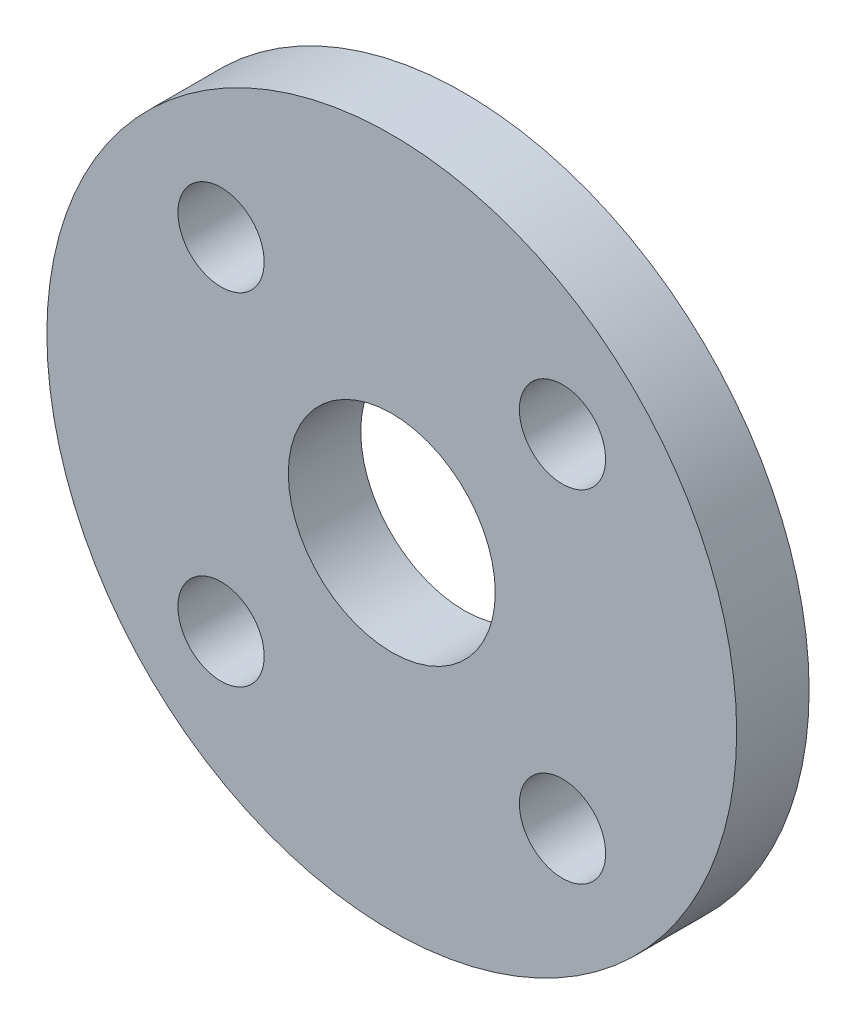
ISO-10303-21;
HEADER;
FILE_DESCRIPTION(('STEP AP214'),'2;1');
FILE_NAME('part.step','',(''),(''),'','','');
FILE_SCHEMA(('AUTOMOTIVE_DESIGN { 1 0 10303 214 1 1 1 1 }'));
ENDSEC;
DATA;
#1=APPLICATION_CONTEXT('core data for automotive mechanical design processes');
#2=APPLICATION_PROTOCOL_DEFINITION('international standard','automotive_design',2000,#1);
#3=PRODUCT_CONTEXT('',#1,'mechanical');
#4=PRODUCT('Part','Part','',(#3));
#5=PRODUCT_RELATED_PRODUCT_CATEGORY('part','',(#4));
#6=PRODUCT_DEFINITION_FORMATION('','',#4);
#7=PRODUCT_DEFINITION_CONTEXT('part definition',#1,'design');
#8=PRODUCT_DEFINITION('design','',#6,#7);
#9=PRODUCT_DEFINITION_SHAPE('','',#8);
#10=(LENGTH_UNIT() NAMED_UNIT(*) SI_UNIT(.MILLI.,.METRE.));
#11=(NAMED_UNIT(*) PLANE_ANGLE_UNIT() SI_UNIT($,.RADIAN.));
#12=(NAMED_UNIT(*) SI_UNIT($,.STERADIAN.) SOLID_ANGLE_UNIT());
#13=UNCERTAINTY_MEASURE_WITH_UNIT(LENGTH_MEASURE(1.E-05),#10,'distance_accuracy_value','');
#14=(GEOMETRIC_REPRESENTATION_CONTEXT(3) GLOBAL_UNCERTAINTY_ASSIGNED_CONTEXT((#13)) GLOBAL_UNIT_ASSIGNED_CONTEXT((#10,
#11,#12)) REPRESENTATION_CONTEXT('',''));
#15=CARTESIAN_POINT('',(0.,0.,0.));
#16=DIRECTION('',(0.,0.,1.));
#17=DIRECTION('',(1.,0.,0.));
#18=AXIS2_PLACEMENT_3D('',#15,#16,#17);
#19=CARTESIAN_POINT('',(12.5,0.,-16.9));
#20=DIRECTION('',(0.,0.,1.));
#21=DIRECTION('',(1.,0.,0.));
#22=AXIS2_PLACEMENT_3D('',#19,#20,#21);
#23=CYLINDRICAL_SURFACE('',#22,3.);
#24=CARTESIAN_POINT('',(12.5,0.,-15.6));
#25=DIRECTION('',(0.,0.,1.));
#26=DIRECTION('',(1.,0.,0.));
#27=AXIS2_PLACEMENT_3D('',#24,#25,#26);
#28=CIRCLE('',#27,3.);
#29=CARTESIAN_POINT('',(15.5,0.,-15.6));
#30=VERTEX_POINT('',#29);
#31=EDGE_CURVE('E19',#30,#30,#28,.F.);
#32=ORIENTED_EDGE('',*,*,#31,.F.);
#33=EDGE_LOOP('',(#32));
#34=FACE_BOUND('',#33,.T.);
#35=CARTESIAN_POINT('',(12.5,0.,-17.7));
#36=DIRECTION('',(0.,0.,1.));
#37=DIRECTION('',(1.,0.,0.));
#38=AXIS2_PLACEMENT_3D('',#35,#36,#37);
#39=CIRCLE('',#38,3.);
#40=CARTESIAN_POINT('',(15.5,0.,-17.7));
#41=VERTEX_POINT('',#40);
#42=EDGE_CURVE('E65',#41,#41,#39,.F.);
#43=ORIENTED_EDGE('',*,*,#42,.T.);
#44=EDGE_LOOP('',(#43));
#45=FACE_BOUND('',#44,.T.);
#46=ADVANCED_FACE('F15',(#34,#45),#23,.F.);
#47=CARTESIAN_POINT('',(12.5,0.,-15.6));
#48=DIRECTION('',(0.,0.,-1.));
#49=DIRECTION('',(-1.,0.,0.));
#50=AXIS2_PLACEMENT_3D('',#47,#48,#49);
#51=CYLINDRICAL_SURFACE('',#50,10.);
#52=CARTESIAN_POINT('',(12.5,0.,-15.6));
#53=DIRECTION('',(0.,0.,-1.));
#54=DIRECTION('',(-1.,0.,0.));
#55=AXIS2_PLACEMENT_3D('',#52,#53,#54);
#56=CIRCLE('',#55,10.);
#57=CARTESIAN_POINT('',(2.5,0.,-15.6));
#58=VERTEX_POINT('',#57);
#59=EDGE_CURVE('E58',#58,#58,#56,.T.);
#60=ORIENTED_EDGE('',*,*,#59,.T.);
#61=EDGE_LOOP('',(#60));
#62=FACE_BOUND('',#61,.T.);
#63=CARTESIAN_POINT('',(12.5,0.,-17.7));
#64=DIRECTION('',(0.,0.,-1.));
#65=DIRECTION('',(-1.,0.,0.));
#66=AXIS2_PLACEMENT_3D('',#63,#64,#65);
#67=CIRCLE('',#66,10.);
#68=CARTESIAN_POINT('',(2.5,0.,-17.7));
#69=VERTEX_POINT('',#68);
#70=EDGE_CURVE('E62',#69,#69,#67,.T.);
#71=ORIENTED_EDGE('',*,*,#70,.F.);
#72=EDGE_LOOP('',(#71));
#73=FACE_BOUND('',#72,.T.);
#74=ADVANCED_FACE('F81',(#62,#73),#51,.T.);
#75=CARTESIAN_POINT('',(12.5,0.,-15.6));
#76=DIRECTION('',(0.,0.,-1.));
#77=DIRECTION('',(-1.,0.,0.));
#78=AXIS2_PLACEMENT_3D('',#75,#76,#77);
#79=PLANE('',#78);
#80=ORIENTED_EDGE('',*,*,#59,.F.);
#81=EDGE_LOOP('',(#80));
#82=FACE_BOUND('',#81,.T.);
#83=ORIENTED_EDGE('',*,*,#31,.T.);
#84=EDGE_LOOP('',(#83));
#85=FACE_BOUND('',#84,.T.);
#86=CARTESIAN_POINT('',(7.55025253169417,4.94974746830583,-15.6));
#87=DIRECTION('',(0.,0.,-1.));
#88=DIRECTION('',(-1.,0.,0.));
#89=AXIS2_PLACEMENT_3D('',#86,#87,#88);
#90=CIRCLE('',#89,1.25);
#91=CARTESIAN_POINT('',(6.30025253169417,4.94974746830583,-15.6));
#92=VERTEX_POINT('',#91);
#93=EDGE_CURVE('E54',#92,#92,#90,.T.);
#94=ORIENTED_EDGE('',*,*,#93,.T.);
#95=EDGE_LOOP('',(#94));
#96=FACE_BOUND('',#95,.T.);
#97=CARTESIAN_POINT('',(7.55025253169417,-4.94974746830583,-15.6));
#98=DIRECTION('',(0.,0.,-1.));
#99=DIRECTION('',(-1.,0.,0.));
#100=AXIS2_PLACEMENT_3D('',#97,#98,#99);
#101=CIRCLE('',#100,1.25);
#102=CARTESIAN_POINT('',(6.30025253169417,-4.94974746830583,-15.6));
#103=VERTEX_POINT('',#102);
#104=EDGE_CURVE('E50',#103,#103,#101,.T.);
#105=ORIENTED_EDGE('',*,*,#104,.T.);
#106=EDGE_LOOP('',(#105));
#107=FACE_BOUND('',#106,.T.);
#108=CARTESIAN_POINT('',(17.4497474683058,-4.94974746830583,-15.6));
#109=DIRECTION('',(0.,0.,-1.));
#110=DIRECTION('',(-1.,0.,0.));
#111=AXIS2_PLACEMENT_3D('',#108,#109,#110);
#112=CIRCLE('',#111,1.25);
#113=CARTESIAN_POINT('',(16.1997474683058,-4.94974746830583,-15.6));
#114=VERTEX_POINT('',#113);
#115=EDGE_CURVE('E46',#114,#114,#112,.T.);
#116=ORIENTED_EDGE('',*,*,#115,.T.);
#117=EDGE_LOOP('',(#116));
#118=FACE_BOUND('',#117,.T.);
#119=CARTESIAN_POINT('',(17.4497474683058,4.94974746830583,-15.6));
#120=DIRECTION('',(0.,0.,-1.));
#121=DIRECTION('',(-1.,0.,0.));
#122=AXIS2_PLACEMENT_3D('',#119,#120,#121);
#123=CIRCLE('',#122,1.25);
#124=CARTESIAN_POINT('',(16.1997474683058,4.94974746830583,-15.6));
#125=VERTEX_POINT('',#124);
#126=EDGE_CURVE('E42',#125,#125,#123,.T.);
#127=ORIENTED_EDGE('',*,*,#126,.T.);
#128=EDGE_LOOP('',(#127));
#129=FACE_BOUND('',#128,.T.);
#130=ADVANCED_FACE('F77',(#82,#85,#96,#107,#118,#129),#79,.F.);
#131=CARTESIAN_POINT('',(17.4497474683058,4.94974746830583,-15.6));
#132=DIRECTION('',(0.,0.,-1.));
#133=DIRECTION('',(-1.,0.,0.));
#134=AXIS2_PLACEMENT_3D('',#131,#132,#133);
#135=CYLINDRICAL_SURFACE('',#134,1.25);
#136=CARTESIAN_POINT('',(17.4497474683058,4.94974746830583,-17.7));
#137=DIRECTION('',(0.,0.,-1.));
#138=DIRECTION('',(-1.,0.,0.));
#139=AXIS2_PLACEMENT_3D('',#136,#137,#138);
#140=CIRCLE('',#139,1.25);
#141=CARTESIAN_POINT('',(16.1997474683058,4.94974746830583,-17.7));
#142=VERTEX_POINT('',#141);
#143=EDGE_CURVE('E38',#142,#142,#140,.T.);
#144=ORIENTED_EDGE('',*,*,#143,.T.);
#145=EDGE_LOOP('',(#144));
#146=FACE_BOUND('',#145,.T.);
#147=ORIENTED_EDGE('',*,*,#126,.F.);
#148=EDGE_LOOP('',(#147));
#149=FACE_BOUND('',#148,.T.);
#150=ADVANCED_FACE('F92',(#146,#149),#135,.F.);
#151=CARTESIAN_POINT('',(17.4497474683058,-4.94974746830583,-15.6));
#152=DIRECTION('',(0.,0.,-1.));
#153=DIRECTION('',(-1.,0.,0.));
#154=AXIS2_PLACEMENT_3D('',#151,#152,#153);
#155=CYLINDRICAL_SURFACE('',#154,1.25);
#156=CARTESIAN_POINT('',(17.4497474683058,-4.94974746830583,-17.7));
#157=DIRECTION('',(0.,0.,-1.));
#158=DIRECTION('',(-1.,0.,0.));
#159=AXIS2_PLACEMENT_3D('',#156,#157,#158);
#160=CIRCLE('',#159,1.25);
#161=CARTESIAN_POINT('',(16.1997474683058,-4.94974746830583,-17.7));
#162=VERTEX_POINT('',#161);
#163=EDGE_CURVE('E32',#162,#162,#160,.T.);
#164=ORIENTED_EDGE('',*,*,#163,.T.);
#165=EDGE_LOOP('',(#164));
#166=FACE_BOUND('',#165,.T.);
#167=ORIENTED_EDGE('',*,*,#115,.F.);
#168=EDGE_LOOP('',(#167));
#169=FACE_BOUND('',#168,.T.);
#170=ADVANCED_FACE('F96',(#166,#169),#155,.F.);
#171=CARTESIAN_POINT('',(7.55025253169417,-4.94974746830583,-15.6));
#172=DIRECTION('',(0.,0.,-1.));
#173=DIRECTION('',(-1.,0.,0.));
#174=AXIS2_PLACEMENT_3D('',#171,#172,#173);
#175=CYLINDRICAL_SURFACE('',#174,1.25);
#176=CARTESIAN_POINT('',(7.55025253169417,-4.94974746830583,-17.7));
#177=DIRECTION('',(0.,0.,-1.));
#178=DIRECTION('',(-1.,0.,0.));
#179=AXIS2_PLACEMENT_3D('',#176,#177,#178);
#180=CIRCLE('',#179,1.25);
#181=CARTESIAN_POINT('',(6.30025253169417,-4.94974746830583,-17.7));
#182=VERTEX_POINT('',#181);
#183=EDGE_CURVE('E24',#182,#182,#180,.T.);
#184=ORIENTED_EDGE('',*,*,#183,.T.);
#185=EDGE_LOOP('',(#184));
#186=FACE_BOUND('',#185,.T.);
#187=ORIENTED_EDGE('',*,*,#104,.F.);
#188=EDGE_LOOP('',(#187));
#189=FACE_BOUND('',#188,.T.);
#190=ADVANCED_FACE('F100',(#186,#189),#175,.F.);
#191=CARTESIAN_POINT('',(7.55025253169417,4.94974746830583,-15.6));
#192=DIRECTION('',(0.,0.,-1.));
#193=DIRECTION('',(-1.,0.,0.));
#194=AXIS2_PLACEMENT_3D('',#191,#192,#193);
#195=CYLINDRICAL_SURFACE('',#194,1.25);
#196=CARTESIAN_POINT('',(7.55025253169417,4.94974746830583,-17.7));
#197=DIRECTION('',(0.,0.,-1.));
#198=DIRECTION('',(-1.,0.,0.));
#199=AXIS2_PLACEMENT_3D('',#196,#197,#198);
#200=CIRCLE('',#199,1.25);
#201=CARTESIAN_POINT('',(6.30025253169417,4.94974746830583,-17.7));
#202=VERTEX_POINT('',#201);
#203=EDGE_CURVE('E10',#202,#202,#200,.T.);
#204=ORIENTED_EDGE('',*,*,#203,.T.);
#205=EDGE_LOOP('',(#204));
#206=FACE_BOUND('',#205,.T.);
#207=ORIENTED_EDGE('',*,*,#93,.F.);
#208=EDGE_LOOP('',(#207));
#209=FACE_BOUND('',#208,.T.);
#210=ADVANCED_FACE('F103',(#206,#209),#195,.F.);
#211=CARTESIAN_POINT('',(12.5,0.,-17.7));
#212=DIRECTION('',(0.,0.,-1.));
#213=DIRECTION('',(-1.,0.,0.));
#214=AXIS2_PLACEMENT_3D('',#211,#212,#213);
#215=PLANE('',#214);
#216=ORIENTED_EDGE('',*,*,#70,.T.);
#217=EDGE_LOOP('',(#216));
#218=FACE_BOUND('',#217,.T.);
#219=ORIENTED_EDGE('',*,*,#42,.F.);
#220=EDGE_LOOP('',(#219));
#221=FACE_BOUND('',#220,.T.);
#222=ORIENTED_EDGE('',*,*,#203,.F.);
#223=EDGE_LOOP('',(#222));
#224=FACE_BOUND('',#223,.T.);
#225=ORIENTED_EDGE('',*,*,#183,.F.);
#226=EDGE_LOOP('',(#225));
#227=FACE_BOUND('',#226,.T.);
#228=ORIENTED_EDGE('',*,*,#163,.F.);
#229=EDGE_LOOP('',(#228));
#230=FACE_BOUND('',#229,.T.);
#231=ORIENTED_EDGE('',*,*,#143,.F.);
#232=EDGE_LOOP('',(#231));
#233=FACE_BOUND('',#232,.T.);
#234=ADVANCED_FACE('F17',(#218,#221,#224,#227,#230,#233),#215,.T.);
#235=CLOSED_SHELL('',(#46,#74,#130,#150,#170,#190,#210,#234));
#236=MANIFOLD_SOLID_BREP('B1',#235);
#237=ADVANCED_BREP_SHAPE_REPRESENTATION('',(#18,#236),#14);
#238=SHAPE_DEFINITION_REPRESENTATION(#9,#237);
ENDSEC;
END-ISO-10303-21;
